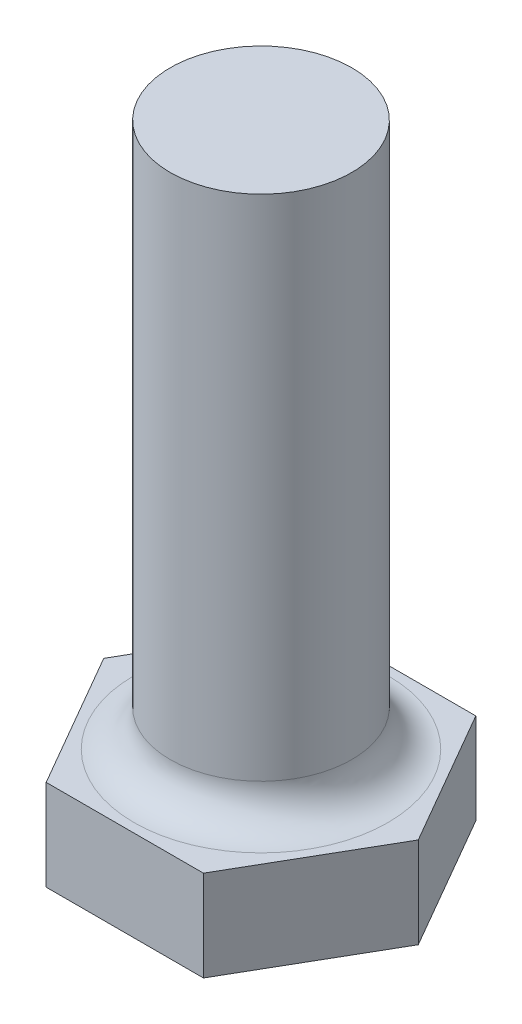
ISO-10303-21;
HEADER;
FILE_DESCRIPTION(('STEP AP214'),'2;1');
FILE_NAME('part.step','',(''),(''),'','','');
FILE_SCHEMA(('AUTOMOTIVE_DESIGN { 1 0 10303 214 1 1 1 1 }'));
ENDSEC;
DATA;
#1=APPLICATION_CONTEXT('core data for automotive mechanical design processes');
#2=APPLICATION_PROTOCOL_DEFINITION('international standard','automotive_design',2000,#1);
#3=PRODUCT_CONTEXT('',#1,'mechanical');
#4=PRODUCT('Part','Part','',(#3));
#5=PRODUCT_RELATED_PRODUCT_CATEGORY('part','',(#4));
#6=PRODUCT_DEFINITION_FORMATION('','',#4);
#7=PRODUCT_DEFINITION_CONTEXT('part definition',#1,'design');
#8=PRODUCT_DEFINITION('design','',#6,#7);
#9=PRODUCT_DEFINITION_SHAPE('','',#8);
#10=(LENGTH_UNIT() NAMED_UNIT(*) SI_UNIT(.MILLI.,.METRE.));
#11=(NAMED_UNIT(*) PLANE_ANGLE_UNIT() SI_UNIT($,.RADIAN.));
#12=(NAMED_UNIT(*) SI_UNIT($,.STERADIAN.) SOLID_ANGLE_UNIT());
#13=UNCERTAINTY_MEASURE_WITH_UNIT(LENGTH_MEASURE(1.E-05),#10,'distance_accuracy_value','');
#14=(GEOMETRIC_REPRESENTATION_CONTEXT(3) GLOBAL_UNCERTAINTY_ASSIGNED_CONTEXT((#13)) GLOBAL_UNIT_ASSIGNED_CONTEXT((#10,
#11,#12)) REPRESENTATION_CONTEXT('',''));
#15=CARTESIAN_POINT('',(0.,0.,0.));
#16=DIRECTION('',(0.,0.,1.));
#17=DIRECTION('',(1.,0.,0.));
#18=AXIS2_PLACEMENT_3D('',#15,#16,#17);
#19=CARTESIAN_POINT('',(0.,5.,0.));
#20=DIRECTION('',(0.,1.,0.));
#21=DIRECTION('',(0.,0.,1.));
#22=AXIS2_PLACEMENT_3D('',#19,#20,#21);
#23=PLANE('',#22);
#24=CARTESIAN_POINT('',(0.,5.,0.));
#25=DIRECTION('',(0.,1.,0.));
#26=DIRECTION('',(0.,0.,1.));
#27=AXIS2_PLACEMENT_3D('',#24,#25,#26);
#28=CIRCLE('',#27,7.);
#29=CARTESIAN_POINT('',(0.,5.,7.));
#30=VERTEX_POINT('',#29);
#31=EDGE_CURVE('E11',#30,#30,#28,.F.);
#32=ORIENTED_EDGE('',*,*,#31,.T.);
#33=EDGE_LOOP('',(#32));
#34=FACE_BOUND('',#33,.T.);
#35=DIRECTION('',(0.5,0.,-0.866025403784439));
#36=VECTOR('',#35,1.);
#37=CARTESIAN_POINT('',(4.33012701892221,5.,7.50000000000003));
#38=LINE('',#37,#36);
#39=CARTESIAN_POINT('',(4.33012701892221,5.,7.50000000000003));
#40=VERTEX_POINT('',#39);
#41=CARTESIAN_POINT('',(8.66025403784442,5.,0.));
#42=VERTEX_POINT('',#41);
#43=EDGE_CURVE('E129',#40,#42,#38,.T.);
#44=ORIENTED_EDGE('',*,*,#43,.T.);
#45=DIRECTION('',(-0.5,0.,-0.866025403784439));
#46=VECTOR('',#45,1.);
#47=CARTESIAN_POINT('',(8.66025403784442,5.,0.));
#48=LINE('',#47,#46);
#49=CARTESIAN_POINT('',(4.33012701892221,5.,-7.50000000000003));
#50=VERTEX_POINT('',#49);
#51=EDGE_CURVE('E88',#42,#50,#48,.T.);
#52=ORIENTED_EDGE('',*,*,#51,.T.);
#53=DIRECTION('',(-1.,0.,0.));
#54=VECTOR('',#53,1.);
#55=CARTESIAN_POINT('',(4.33012701892221,5.,-7.50000000000003));
#56=LINE('',#55,#54);
#57=CARTESIAN_POINT('',(-4.33012701892221,5.,-7.50000000000003));
#58=VERTEX_POINT('',#57);
#59=EDGE_CURVE('E100',#50,#58,#56,.T.);
#60=ORIENTED_EDGE('',*,*,#59,.T.);
#61=DIRECTION('',(-0.5,0.,0.866025403784439));
#62=VECTOR('',#61,1.);
#63=CARTESIAN_POINT('',(-4.33012701892221,5.,-7.50000000000003));
#64=LINE('',#63,#62);
#65=CARTESIAN_POINT('',(-8.66025403784442,5.,0.));
#66=VERTEX_POINT('',#65);
#67=EDGE_CURVE('E95',#58,#66,#64,.T.);
#68=ORIENTED_EDGE('',*,*,#67,.T.);
#69=DIRECTION('',(0.5,0.,0.866025403784439));
#70=VECTOR('',#69,1.);
#71=CARTESIAN_POINT('',(-8.66025403784442,5.,0.));
#72=LINE('',#71,#70);
#73=CARTESIAN_POINT('',(-4.33012701892221,5.,7.50000000000002));
#74=VERTEX_POINT('',#73);
#75=EDGE_CURVE('E98',#66,#74,#72,.T.);
#76=ORIENTED_EDGE('',*,*,#75,.T.);
#77=DIRECTION('',(1.,0.,0.));
#78=VECTOR('',#77,1.);
#79=CARTESIAN_POINT('',(-4.33012701892221,5.,7.50000000000002));
#80=LINE('',#79,#78);
#81=EDGE_CURVE('E50',#74,#40,#80,.T.);
#82=ORIENTED_EDGE('',*,*,#81,.T.);
#83=EDGE_LOOP('',(#44,#52,#60,#68,#76,#82));
#84=FACE_BOUND('',#83,.T.);
#85=ADVANCED_FACE('F33',(#34,#84),#23,.T.);
#86=CARTESIAN_POINT('',(4.33012701892221,5.,7.50000000000003));
#87=DIRECTION('',(-0.866025403784439,0.,-0.5));
#88=DIRECTION('',(-0.5,0.,0.866025403784439));
#89=AXIS2_PLACEMENT_3D('',#86,#87,#88);
#90=PLANE('',#89);
#91=DIRECTION('',(0.5,0.,-0.866025403784439));
#92=VECTOR('',#91,1.);
#93=CARTESIAN_POINT('',(4.33012701892221,0.,7.50000000000003));
#94=LINE('',#93,#92);
#95=CARTESIAN_POINT('',(4.33012701892221,0.,7.50000000000003));
#96=VERTEX_POINT('',#95);
#97=CARTESIAN_POINT('',(8.66025403784442,0.,0.));
#98=VERTEX_POINT('',#97);
#99=EDGE_CURVE('E118',#96,#98,#94,.T.);
#100=ORIENTED_EDGE('',*,*,#99,.T.);
#101=DIRECTION('',(0.,-1.,0.));
#102=VECTOR('',#101,1.);
#103=CARTESIAN_POINT('',(8.66025403784442,5.,0.));
#104=LINE('',#103,#102);
#105=EDGE_CURVE('E136',#42,#98,#104,.T.);
#106=ORIENTED_EDGE('',*,*,#105,.F.);
#107=ORIENTED_EDGE('',*,*,#43,.F.);
#108=DIRECTION('',(0.,-1.,0.));
#109=VECTOR('',#108,1.);
#110=CARTESIAN_POINT('',(4.33012701892221,5.,7.50000000000003));
#111=LINE('',#110,#109);
#112=EDGE_CURVE('E114',#40,#96,#111,.T.);
#113=ORIENTED_EDGE('',*,*,#112,.T.);
#114=EDGE_LOOP('',(#100,#106,#107,#113));
#115=FACE_BOUND('',#114,.T.);
#116=ADVANCED_FACE('F153',(#115),#90,.F.);
#117=CARTESIAN_POINT('',(8.66025403784442,5.,0.));
#118=DIRECTION('',(-0.866025403784439,0.,0.5));
#119=DIRECTION('',(0.5,0.,0.866025403784439));
#120=AXIS2_PLACEMENT_3D('',#117,#118,#119);
#121=PLANE('',#120);
#122=DIRECTION('',(-0.5,0.,-0.866025403784439));
#123=VECTOR('',#122,1.);
#124=CARTESIAN_POINT('',(8.66025403784442,0.,0.));
#125=LINE('',#124,#123);
#126=CARTESIAN_POINT('',(4.33012701892221,0.,-7.50000000000003));
#127=VERTEX_POINT('',#126);
#128=EDGE_CURVE('E121',#98,#127,#125,.T.);
#129=ORIENTED_EDGE('',*,*,#128,.T.);
#130=DIRECTION('',(0.,-1.,0.));
#131=VECTOR('',#130,1.);
#132=CARTESIAN_POINT('',(4.33012701892221,5.,-7.50000000000003));
#133=LINE('',#132,#131);
#134=EDGE_CURVE('E133',#50,#127,#133,.T.);
#135=ORIENTED_EDGE('',*,*,#134,.F.);
#136=ORIENTED_EDGE('',*,*,#51,.F.);
#137=ORIENTED_EDGE('',*,*,#105,.T.);
#138=EDGE_LOOP('',(#129,#135,#136,#137));
#139=FACE_BOUND('',#138,.T.);
#140=ADVANCED_FACE('F159',(#139),#121,.F.);
#141=CARTESIAN_POINT('',(4.33012701892221,5.,-7.50000000000003));
#142=DIRECTION('',(0.,0.,1.));
#143=DIRECTION('',(1.,0.,0.));
#144=AXIS2_PLACEMENT_3D('',#141,#142,#143);
#145=PLANE('',#144);
#146=DIRECTION('',(-1.,0.,0.));
#147=VECTOR('',#146,1.);
#148=CARTESIAN_POINT('',(4.33012701892221,0.,-7.50000000000003));
#149=LINE('',#148,#147);
#150=CARTESIAN_POINT('',(-4.33012701892221,0.,-7.50000000000003));
#151=VERTEX_POINT('',#150);
#152=EDGE_CURVE('E124',#127,#151,#149,.T.);
#153=ORIENTED_EDGE('',*,*,#152,.T.);
#154=DIRECTION('',(0.,-1.,0.));
#155=VECTOR('',#154,1.);
#156=CARTESIAN_POINT('',(-4.33012701892221,5.,-7.50000000000003));
#157=LINE('',#156,#155);
#158=EDGE_CURVE('E109',#58,#151,#157,.T.);
#159=ORIENTED_EDGE('',*,*,#158,.F.);
#160=ORIENTED_EDGE('',*,*,#59,.F.);
#161=ORIENTED_EDGE('',*,*,#134,.T.);
#162=EDGE_LOOP('',(#153,#159,#160,#161));
#163=FACE_BOUND('',#162,.T.);
#164=ADVANCED_FACE('F174',(#163),#145,.F.);
#165=CARTESIAN_POINT('',(-4.33012701892221,5.,-7.50000000000003));
#166=DIRECTION('',(0.866025403784438,0.,0.5));
#167=DIRECTION('',(0.5,0.,-0.866025403784439));
#168=AXIS2_PLACEMENT_3D('',#165,#166,#167);
#169=PLANE('',#168);
#170=DIRECTION('',(-0.5,0.,0.866025403784439));
#171=VECTOR('',#170,1.);
#172=CARTESIAN_POINT('',(-4.33012701892221,0.,-7.50000000000003));
#173=LINE('',#172,#171);
#174=CARTESIAN_POINT('',(-8.66025403784442,0.,0.));
#175=VERTEX_POINT('',#174);
#176=EDGE_CURVE('E108',#151,#175,#173,.T.);
#177=ORIENTED_EDGE('',*,*,#176,.T.);
#178=DIRECTION('',(0.,-1.,0.));
#179=VECTOR('',#178,1.);
#180=CARTESIAN_POINT('',(-8.66025403784442,5.,0.));
#181=LINE('',#180,#179);
#182=EDGE_CURVE('E105',#66,#175,#181,.T.);
#183=ORIENTED_EDGE('',*,*,#182,.F.);
#184=ORIENTED_EDGE('',*,*,#67,.F.);
#185=ORIENTED_EDGE('',*,*,#158,.T.);
#186=EDGE_LOOP('',(#177,#183,#184,#185));
#187=FACE_BOUND('',#186,.T.);
#188=ADVANCED_FACE('F106',(#187),#169,.F.);
#189=CARTESIAN_POINT('',(-8.66025403784442,5.,0.));
#190=DIRECTION('',(0.866025403784439,0.,-0.5));
#191=DIRECTION('',(-0.5,0.,-0.866025403784439));
#192=AXIS2_PLACEMENT_3D('',#189,#190,#191);
#193=PLANE('',#192);
#194=DIRECTION('',(0.5,0.,0.866025403784439));
#195=VECTOR('',#194,1.);
#196=CARTESIAN_POINT('',(-8.66025403784442,0.,0.));
#197=LINE('',#196,#195);
#198=CARTESIAN_POINT('',(-4.33012701892221,0.,7.50000000000002));
#199=VERTEX_POINT('',#198);
#200=EDGE_CURVE('E73',#175,#199,#197,.T.);
#201=ORIENTED_EDGE('',*,*,#200,.T.);
#202=DIRECTION('',(0.,-1.,0.));
#203=VECTOR('',#202,1.);
#204=CARTESIAN_POINT('',(-4.33012701892221,5.,7.50000000000002));
#205=LINE('',#204,#203);
#206=EDGE_CURVE('E110',#74,#199,#205,.T.);
#207=ORIENTED_EDGE('',*,*,#206,.F.);
#208=ORIENTED_EDGE('',*,*,#75,.F.);
#209=ORIENTED_EDGE('',*,*,#182,.T.);
#210=EDGE_LOOP('',(#201,#207,#208,#209));
#211=FACE_BOUND('',#210,.T.);
#212=ADVANCED_FACE('F112',(#211),#193,.F.);
#213=CARTESIAN_POINT('',(-4.33012701892221,5.,7.50000000000002));
#214=DIRECTION('',(0.,0.,-1.));
#215=DIRECTION('',(-1.,0.,0.));
#216=AXIS2_PLACEMENT_3D('',#213,#214,#215);
#217=PLANE('',#216);
#218=DIRECTION('',(1.,0.,0.));
#219=VECTOR('',#218,1.);
#220=CARTESIAN_POINT('',(-4.33012701892221,0.,7.50000000000002));
#221=LINE('',#220,#219);
#222=EDGE_CURVE('E79',#199,#96,#221,.T.);
#223=ORIENTED_EDGE('',*,*,#222,.T.);
#224=ORIENTED_EDGE('',*,*,#112,.F.);
#225=ORIENTED_EDGE('',*,*,#81,.F.);
#226=ORIENTED_EDGE('',*,*,#206,.T.);
#227=EDGE_LOOP('',(#223,#224,#225,#226));
#228=FACE_BOUND('',#227,.T.);
#229=ADVANCED_FACE('F166',(#228),#217,.F.);
#230=CARTESIAN_POINT('',(0.,0.,0.));
#231=DIRECTION('',(0.,1.,0.));
#232=DIRECTION('',(0.,0.,1.));
#233=AXIS2_PLACEMENT_3D('',#230,#231,#232);
#234=PLANE('',#233);
#235=ORIENTED_EDGE('',*,*,#99,.F.);
#236=ORIENTED_EDGE('',*,*,#222,.F.);
#237=ORIENTED_EDGE('',*,*,#200,.F.);
#238=ORIENTED_EDGE('',*,*,#176,.F.);
#239=ORIENTED_EDGE('',*,*,#152,.F.);
#240=ORIENTED_EDGE('',*,*,#128,.F.);
#241=EDGE_LOOP('',(#235,#236,#237,#238,#239,#240));
#242=FACE_BOUND('',#241,.T.);
#243=ADVANCED_FACE('F163',(#242),#234,.F.);
#244=CARTESIAN_POINT('',(0.,35.,0.));
#245=DIRECTION('',(0.,-1.,0.));
#246=DIRECTION('',(0.,0.,-1.));
#247=AXIS2_PLACEMENT_3D('',#244,#245,#246);
#248=CYLINDRICAL_SURFACE('',#247,5.);
#249=CARTESIAN_POINT('',(0.,7.,0.));
#250=DIRECTION('',(0.,1.,0.));
#251=DIRECTION('',(0.,0.,1.));
#252=AXIS2_PLACEMENT_3D('',#249,#250,#251);
#253=CIRCLE('',#252,5.);
#254=CARTESIAN_POINT('',(0.,7.,5.));
#255=VERTEX_POINT('',#254);
#256=EDGE_CURVE('E42',#255,#255,#253,.T.);
#257=ORIENTED_EDGE('',*,*,#256,.T.);
#258=EDGE_LOOP('',(#257));
#259=FACE_BOUND('',#258,.T.);
#260=CARTESIAN_POINT('',(0.,35.,0.));
#261=DIRECTION('',(0.,1.,0.));
#262=DIRECTION('',(0.,0.,1.));
#263=AXIS2_PLACEMENT_3D('',#260,#261,#262);
#264=CIRCLE('',#263,5.);
#265=CARTESIAN_POINT('',(0.,35.,5.));
#266=VERTEX_POINT('',#265);
#267=EDGE_CURVE('E122',#266,#266,#264,.T.);
#268=ORIENTED_EDGE('',*,*,#267,.F.);
#269=EDGE_LOOP('',(#268));
#270=FACE_BOUND('',#269,.T.);
#271=ADVANCED_FACE('F140',(#259,#270),#248,.T.);
#272=CARTESIAN_POINT('',(0.,35.,0.));
#273=DIRECTION('',(0.,1.,0.));
#274=DIRECTION('',(0.,0.,1.));
#275=AXIS2_PLACEMENT_3D('',#272,#273,#274);
#276=PLANE('',#275);
#277=ORIENTED_EDGE('',*,*,#267,.T.);
#278=EDGE_LOOP('',(#277));
#279=FACE_BOUND('',#278,.T.);
#280=ADVANCED_FACE('F144',(#279),#276,.T.);
#281=CARTESIAN_POINT('',(0.,7.,0.));
#282=DIRECTION('',(0.,1.,0.));
#283=DIRECTION('',(0.,0.,1.));
#284=AXIS2_PLACEMENT_3D('',#281,#282,#283);
#285=TOROIDAL_SURFACE('',#284,7.,2.);
#286=ORIENTED_EDGE('',*,*,#31,.F.);
#287=EDGE_LOOP('',(#286));
#288=FACE_BOUND('',#287,.T.);
#289=ORIENTED_EDGE('',*,*,#256,.F.);
#290=EDGE_LOOP('',(#289));
#291=FACE_BOUND('',#290,.T.);
#292=ADVANCED_FACE('F35',(#288,#291),#285,.F.);
#293=CLOSED_SHELL('',(#85,#116,#140,#164,#188,#212,#229,#243,#271,#280,#292));
#294=MANIFOLD_SOLID_BREP('B2',#293);
#295=ADVANCED_BREP_SHAPE_REPRESENTATION('',(#18,#294),#14);
#296=SHAPE_DEFINITION_REPRESENTATION(#9,#295);
ENDSEC;
END-ISO-10303-21;
